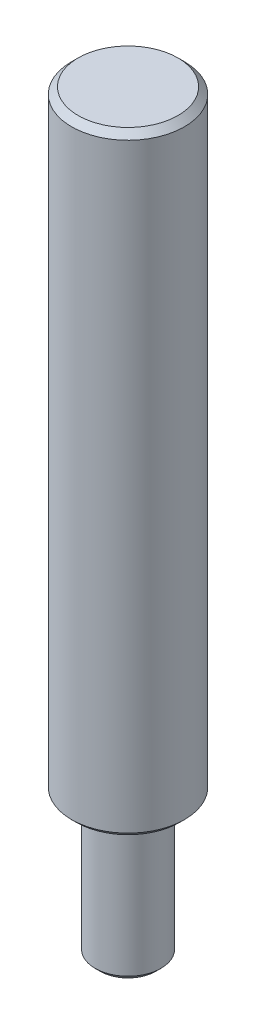
ISO-10303-21;
HEADER;
FILE_DESCRIPTION(('STEP AP214'),'2;1');
FILE_NAME('part.step','',(''),(''),'','','');
FILE_SCHEMA(('AUTOMOTIVE_DESIGN { 1 0 10303 214 1 1 1 1 }'));
ENDSEC;
DATA;
#1=APPLICATION_CONTEXT('core data for automotive mechanical design processes');
#2=APPLICATION_PROTOCOL_DEFINITION('international standard','automotive_design',2000,#1);
#3=PRODUCT_CONTEXT('',#1,'mechanical');
#4=PRODUCT('Part','Part','',(#3));
#5=PRODUCT_RELATED_PRODUCT_CATEGORY('part','',(#4));
#6=PRODUCT_DEFINITION_FORMATION('','',#4);
#7=PRODUCT_DEFINITION_CONTEXT('part definition',#1,'design');
#8=PRODUCT_DEFINITION('design','',#6,#7);
#9=PRODUCT_DEFINITION_SHAPE('','',#8);
#10=(LENGTH_UNIT() NAMED_UNIT(*) SI_UNIT(.MILLI.,.METRE.));
#11=(NAMED_UNIT(*) PLANE_ANGLE_UNIT() SI_UNIT($,.RADIAN.));
#12=(NAMED_UNIT(*) SI_UNIT($,.STERADIAN.) SOLID_ANGLE_UNIT());
#13=UNCERTAINTY_MEASURE_WITH_UNIT(LENGTH_MEASURE(1.E-05),#10,'distance_accuracy_value','');
#14=(GEOMETRIC_REPRESENTATION_CONTEXT(3) GLOBAL_UNCERTAINTY_ASSIGNED_CONTEXT((#13)) GLOBAL_UNIT_ASSIGNED_CONTEXT((#10,
#11,#12)) REPRESENTATION_CONTEXT('',''));
#15=CARTESIAN_POINT('',(0.,0.,0.));
#16=DIRECTION('',(0.,0.,1.));
#17=DIRECTION('',(1.,0.,0.));
#18=AXIS2_PLACEMENT_3D('',#15,#16,#17);
#19=CARTESIAN_POINT('',(0.,65.,0.));
#20=DIRECTION('',(0.,-1.,0.));
#21=DIRECTION('',(0.,0.,-1.));
#22=AXIS2_PLACEMENT_3D('',#19,#20,#21);
#23=CYLINDRICAL_SURFACE('',#22,6.);
#24=CARTESIAN_POINT('',(0.,64.3095,0.));
#25=DIRECTION('',(0.,-1.,0.));
#26=DIRECTION('',(0.,0.,-1.));
#27=AXIS2_PLACEMENT_3D('',#24,#25,#26);
#28=CIRCLE('',#27,6.);
#29=CARTESIAN_POINT('',(0.,64.3095,-6.));
#30=VERTEX_POINT('',#29);
#31=EDGE_CURVE('E70',#30,#30,#28,.T.);
#32=ORIENTED_EDGE('',*,*,#31,.T.);
#33=EDGE_LOOP('',(#32));
#34=FACE_BOUND('',#33,.T.);
#35=CARTESIAN_POINT('',(0.,0.499999999999987,0.));
#36=DIRECTION('',(0.,1.,0.));
#37=DIRECTION('',(0.,0.,1.));
#38=AXIS2_PLACEMENT_3D('',#35,#36,#37);
#39=CIRCLE('',#38,6.);
#40=CARTESIAN_POINT('',(0.,0.499999999999987,6.));
#41=VERTEX_POINT('',#40);
#42=EDGE_CURVE('E60',#41,#41,#39,.T.);
#43=ORIENTED_EDGE('',*,*,#42,.T.);
#44=EDGE_LOOP('',(#43));
#45=FACE_BOUND('',#44,.T.);
#46=ADVANCED_FACE('F51',(#34,#45),#23,.T.);
#47=CARTESIAN_POINT('',(0.,0.,0.));
#48=DIRECTION('',(0.,1.,0.));
#49=DIRECTION('',(0.,0.,1.));
#50=AXIS2_PLACEMENT_3D('',#47,#48,#49);
#51=PLANE('',#50);
#52=CARTESIAN_POINT('',(0.,0.,0.));
#53=DIRECTION('',(0.,1.,0.));
#54=DIRECTION('',(0.,0.,1.));
#55=AXIS2_PLACEMENT_3D('',#52,#53,#54);
#56=CIRCLE('',#55,5.50000000000002);
#57=CARTESIAN_POINT('',(0.,0.,5.50000000000002));
#58=VERTEX_POINT('',#57);
#59=EDGE_CURVE('E10',#58,#58,#56,.F.);
#60=ORIENTED_EDGE('',*,*,#59,.T.);
#61=EDGE_LOOP('',(#60));
#62=FACE_BOUND('',#61,.T.);
#63=CARTESIAN_POINT('',(0.,0.,0.));
#64=DIRECTION('',(0.,-1.,0.));
#65=DIRECTION('',(0.,0.,-1.));
#66=AXIS2_PLACEMENT_3D('',#63,#64,#65);
#67=CIRCLE('',#66,3.5);
#68=CARTESIAN_POINT('',(0.,0.,-3.5));
#69=VERTEX_POINT('',#68);
#70=EDGE_CURVE('E65',#69,#69,#67,.T.);
#71=ORIENTED_EDGE('',*,*,#70,.F.);
#72=EDGE_LOOP('',(#71));
#73=FACE_BOUND('',#72,.T.);
#74=ADVANCED_FACE('F104',(#62,#73),#51,.F.);
#75=CARTESIAN_POINT('',(0.,-15.,0.));
#76=DIRECTION('',(0.,1.,0.));
#77=DIRECTION('',(0.,0.,1.));
#78=AXIS2_PLACEMENT_3D('',#75,#76,#77);
#79=CYLINDRICAL_SURFACE('',#78,3.5);
#80=CARTESIAN_POINT('',(0.,-14.4455,0.));
#81=DIRECTION('',(0.,1.,0.));
#82=DIRECTION('',(0.,0.,1.));
#83=AXIS2_PLACEMENT_3D('',#80,#81,#82);
#84=CIRCLE('',#83,3.5);
#85=CARTESIAN_POINT('',(0.,-14.4455,3.5));
#86=VERTEX_POINT('',#85);
#87=EDGE_CURVE('E80',#86,#86,#84,.T.);
#88=ORIENTED_EDGE('',*,*,#87,.T.);
#89=EDGE_LOOP('',(#88));
#90=FACE_BOUND('',#89,.T.);
#91=ORIENTED_EDGE('',*,*,#70,.T.);
#92=EDGE_LOOP('',(#91));
#93=FACE_BOUND('',#92,.T.);
#94=ADVANCED_FACE('F110',(#90,#93),#79,.T.);
#95=CARTESIAN_POINT('',(0.,0.499999999999987,0.));
#96=DIRECTION('',(0.,1.,0.));
#97=DIRECTION('',(0.,0.,1.));
#98=AXIS2_PLACEMENT_3D('',#95,#96,#97);
#99=CONICAL_SURFACE('',#98,6.,0.785398163397443);
#100=ORIENTED_EDGE('',*,*,#59,.F.);
#101=EDGE_LOOP('',(#100));
#102=FACE_BOUND('',#101,.T.);
#103=ORIENTED_EDGE('',*,*,#42,.F.);
#104=EDGE_LOOP('',(#103));
#105=FACE_BOUND('',#104,.T.);
#106=ADVANCED_FACE('F54',(#102,#105),#99,.T.);
#107=CARTESIAN_POINT('',(0.,65.,0.));
#108=DIRECTION('',(0.,-1.,0.));
#109=DIRECTION('',(0.,0.,-1.));
#110=AXIS2_PLACEMENT_3D('',#107,#108,#109);
#111=CONICAL_SURFACE('',#110,5.3095,0.78539816339746);
#112=ORIENTED_EDGE('',*,*,#31,.F.);
#113=EDGE_LOOP('',(#112));
#114=FACE_BOUND('',#113,.T.);
#115=CARTESIAN_POINT('',(0.,65.,0.));
#116=DIRECTION('',(0.,-1.,0.));
#117=DIRECTION('',(0.,0.,-1.));
#118=AXIS2_PLACEMENT_3D('',#115,#116,#117);
#119=CIRCLE('',#118,5.3095);
#120=CARTESIAN_POINT('',(0.,65.,-5.3095));
#121=VERTEX_POINT('',#120);
#122=EDGE_CURVE('E76',#121,#121,#119,.T.);
#123=ORIENTED_EDGE('',*,*,#122,.T.);
#124=EDGE_LOOP('',(#123));
#125=FACE_BOUND('',#124,.T.);
#126=ADVANCED_FACE('F114',(#114,#125),#111,.T.);
#127=CARTESIAN_POINT('',(0.,65.,0.));
#128=DIRECTION('',(0.,1.,0.));
#129=DIRECTION('',(0.,0.,1.));
#130=AXIS2_PLACEMENT_3D('',#127,#128,#129);
#131=PLANE('',#130);
#132=ORIENTED_EDGE('',*,*,#122,.F.);
#133=EDGE_LOOP('',(#132));
#134=FACE_BOUND('',#133,.T.);
#135=ADVANCED_FACE('F98',(#134),#131,.T.);
#136=CARTESIAN_POINT('',(0.,-15.,0.));
#137=DIRECTION('',(0.,1.,0.));
#138=DIRECTION('',(0.,0.,1.));
#139=AXIS2_PLACEMENT_3D('',#136,#137,#138);
#140=CONICAL_SURFACE('',#139,2.9455,0.785398163397458);
#141=ORIENTED_EDGE('',*,*,#87,.F.);
#142=EDGE_LOOP('',(#141));
#143=FACE_BOUND('',#142,.T.);
#144=CARTESIAN_POINT('',(0.,-15.,0.));
#145=DIRECTION('',(0.,1.,0.));
#146=DIRECTION('',(0.,0.,1.));
#147=AXIS2_PLACEMENT_3D('',#144,#145,#146);
#148=CIRCLE('',#147,2.9455);
#149=CARTESIAN_POINT('',(0.,-15.,2.9455));
#150=VERTEX_POINT('',#149);
#151=EDGE_CURVE('E84',#150,#150,#148,.T.);
#152=ORIENTED_EDGE('',*,*,#151,.T.);
#153=EDGE_LOOP('',(#152));
#154=FACE_BOUND('',#153,.T.);
#155=ADVANCED_FACE('F89',(#143,#154),#140,.T.);
#156=CARTESIAN_POINT('',(0.,-15.,0.));
#157=DIRECTION('',(0.,-1.,0.));
#158=DIRECTION('',(0.,0.,-1.));
#159=AXIS2_PLACEMENT_3D('',#156,#157,#158);
#160=PLANE('',#159);
#161=ORIENTED_EDGE('',*,*,#151,.F.);
#162=EDGE_LOOP('',(#161));
#163=FACE_BOUND('',#162,.T.);
#164=ADVANCED_FACE('F91',(#163),#160,.T.);
#165=CLOSED_SHELL('',(#46,#74,#94,#106,#126,#135,#155,#164));
#166=MANIFOLD_SOLID_BREP('B2',#165);
#167=ADVANCED_BREP_SHAPE_REPRESENTATION('',(#18,#166),#14);
#168=SHAPE_DEFINITION_REPRESENTATION(#9,#167);
ENDSEC;
END-ISO-10303-21;
